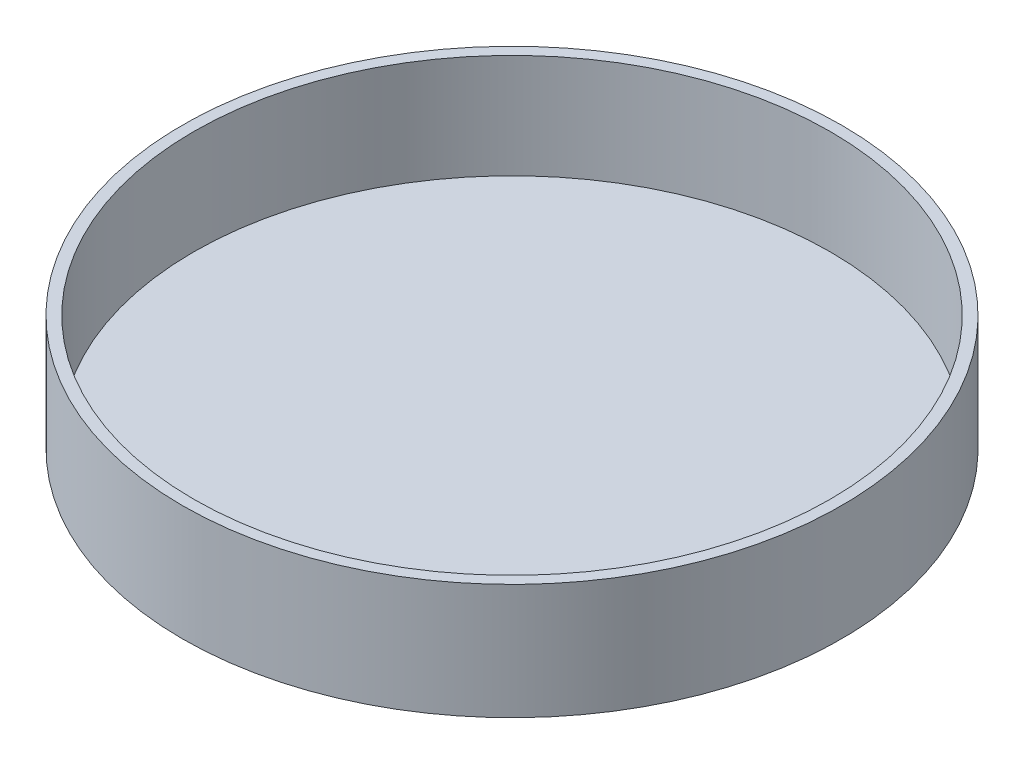
ISO-10303-21;
HEADER;
FILE_DESCRIPTION(('STEP AP214'),'2;1');
FILE_NAME('part.step','',(''),(''),'','','');
FILE_SCHEMA(('AUTOMOTIVE_DESIGN { 1 0 10303 214 1 1 1 1 }'));
ENDSEC;
DATA;
#1=APPLICATION_CONTEXT('core data for automotive mechanical design processes');
#2=APPLICATION_PROTOCOL_DEFINITION('international standard','automotive_design',2000,#1);
#3=PRODUCT_CONTEXT('',#1,'mechanical');
#4=PRODUCT('Part','Part','',(#3));
#5=PRODUCT_RELATED_PRODUCT_CATEGORY('part','',(#4));
#6=PRODUCT_DEFINITION_FORMATION('','',#4);
#7=PRODUCT_DEFINITION_CONTEXT('part definition',#1,'design');
#8=PRODUCT_DEFINITION('design','',#6,#7);
#9=PRODUCT_DEFINITION_SHAPE('','',#8);
#10=(LENGTH_UNIT() NAMED_UNIT(*) SI_UNIT(.MILLI.,.METRE.));
#11=(NAMED_UNIT(*) PLANE_ANGLE_UNIT() SI_UNIT($,.RADIAN.));
#12=(NAMED_UNIT(*) SI_UNIT($,.STERADIAN.) SOLID_ANGLE_UNIT());
#13=UNCERTAINTY_MEASURE_WITH_UNIT(LENGTH_MEASURE(1.E-05),#10,'distance_accuracy_value','');
#14=(GEOMETRIC_REPRESENTATION_CONTEXT(3) GLOBAL_UNCERTAINTY_ASSIGNED_CONTEXT((#13)) GLOBAL_UNIT_ASSIGNED_CONTEXT((#10,
#11,#12)) REPRESENTATION_CONTEXT('',''));
#15=CARTESIAN_POINT('',(0.,0.,0.));
#16=DIRECTION('',(0.,0.,1.));
#17=DIRECTION('',(1.,0.,0.));
#18=AXIS2_PLACEMENT_3D('',#15,#16,#17);
#19=CARTESIAN_POINT('',(0.,0.,0.));
#20=DIRECTION('',(0.,-1.,0.));
#21=DIRECTION('',(0.,0.,-1.));
#22=AXIS2_PLACEMENT_3D('',#19,#20,#21);
#23=PLANE('',#22);
#24=CARTESIAN_POINT('',(0.,0.,0.));
#25=DIRECTION('',(0.,-1.,0.));
#26=DIRECTION('',(0.,0.,-1.));
#27=AXIS2_PLACEMENT_3D('',#24,#25,#26);
#28=CIRCLE('',#27,44.25);
#29=CARTESIAN_POINT('',(0.,0.,-44.25));
#30=VERTEX_POINT('',#29);
#31=EDGE_CURVE('E10',#30,#30,#28,.T.);
#32=ORIENTED_EDGE('',*,*,#31,.T.);
#33=EDGE_LOOP('',(#32));
#34=FACE_BOUND('',#33,.T.);
#35=ADVANCED_FACE('F33',(#34),#23,.T.);
#36=CARTESIAN_POINT('',(0.,0.,0.));
#37=DIRECTION('',(0.,-1.,0.));
#38=DIRECTION('',(0.,0.,-1.));
#39=AXIS2_PLACEMENT_3D('',#36,#37,#38);
#40=CYLINDRICAL_SURFACE('',#39,44.25);
#41=CARTESIAN_POINT('',(0.,15.5,0.));
#42=DIRECTION('',(0.,-1.,0.));
#43=DIRECTION('',(0.,0.,-1.));
#44=AXIS2_PLACEMENT_3D('',#41,#42,#43);
#45=CIRCLE('',#44,44.25);
#46=CARTESIAN_POINT('',(0.,15.5,-44.25));
#47=VERTEX_POINT('',#46);
#48=EDGE_CURVE('E39',#47,#47,#45,.T.);
#49=ORIENTED_EDGE('',*,*,#48,.T.);
#50=EDGE_LOOP('',(#49));
#51=FACE_BOUND('',#50,.T.);
#52=ORIENTED_EDGE('',*,*,#31,.F.);
#53=EDGE_LOOP('',(#52));
#54=FACE_BOUND('',#53,.T.);
#55=ADVANCED_FACE('F65',(#51,#54),#40,.T.);
#56=CARTESIAN_POINT('',(44.25,15.5,0.));
#57=DIRECTION('',(0.,1.,0.));
#58=DIRECTION('',(0.,0.,1.));
#59=AXIS2_PLACEMENT_3D('',#56,#57,#58);
#60=PLANE('',#59);
#61=CARTESIAN_POINT('',(0.,15.5,0.));
#62=DIRECTION('',(0.,-1.,0.));
#63=DIRECTION('',(0.,0.,-1.));
#64=AXIS2_PLACEMENT_3D('',#61,#62,#63);
#65=CIRCLE('',#64,42.75);
#66=CARTESIAN_POINT('',(0.,15.5,-42.75));
#67=VERTEX_POINT('',#66);
#68=EDGE_CURVE('E43',#67,#67,#65,.T.);
#69=ORIENTED_EDGE('',*,*,#68,.T.);
#70=EDGE_LOOP('',(#69));
#71=FACE_BOUND('',#70,.T.);
#72=ORIENTED_EDGE('',*,*,#48,.F.);
#73=EDGE_LOOP('',(#72));
#74=FACE_BOUND('',#73,.T.);
#75=ADVANCED_FACE('F62',(#71,#74),#60,.T.);
#76=CARTESIAN_POINT('',(0.,0.,0.));
#77=DIRECTION('',(0.,-1.,0.));
#78=DIRECTION('',(0.,0.,-1.));
#79=AXIS2_PLACEMENT_3D('',#76,#77,#78);
#80=CYLINDRICAL_SURFACE('',#79,42.75);
#81=CARTESIAN_POINT('',(0.,1.5,0.));
#82=DIRECTION('',(0.,-1.,0.));
#83=DIRECTION('',(0.,0.,-1.));
#84=AXIS2_PLACEMENT_3D('',#81,#82,#83);
#85=CIRCLE('',#84,42.75);
#86=CARTESIAN_POINT('',(0.,1.5,-42.75));
#87=VERTEX_POINT('',#86);
#88=EDGE_CURVE('E47',#87,#87,#85,.T.);
#89=ORIENTED_EDGE('',*,*,#88,.T.);
#90=EDGE_LOOP('',(#89));
#91=FACE_BOUND('',#90,.T.);
#92=ORIENTED_EDGE('',*,*,#68,.F.);
#93=EDGE_LOOP('',(#92));
#94=FACE_BOUND('',#93,.T.);
#95=ADVANCED_FACE('F53',(#91,#94),#80,.F.);
#96=CARTESIAN_POINT('',(42.75,1.5,0.));
#97=DIRECTION('',(0.,1.,0.));
#98=DIRECTION('',(0.,0.,1.));
#99=AXIS2_PLACEMENT_3D('',#96,#97,#98);
#100=PLANE('',#99);
#101=ORIENTED_EDGE('',*,*,#88,.F.);
#102=EDGE_LOOP('',(#101));
#103=FACE_BOUND('',#102,.T.);
#104=ADVANCED_FACE('F56',(#103),#100,.T.);
#105=CLOSED_SHELL('',(#35,#55,#75,#95,#104));
#106=MANIFOLD_SOLID_BREP('B2',#105);
#107=ADVANCED_BREP_SHAPE_REPRESENTATION('',(#18,#106),#14);
#108=SHAPE_DEFINITION_REPRESENTATION(#9,#107);
ENDSEC;
END-ISO-10303-21;
